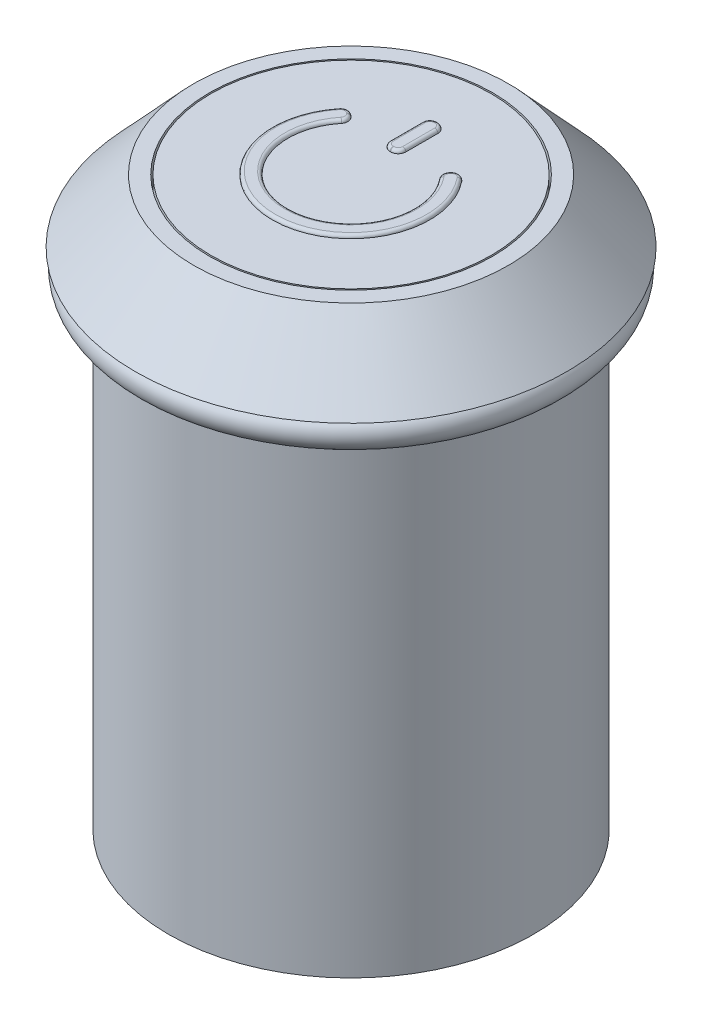
ISO-10303-21;
HEADER;
FILE_DESCRIPTION(('STEP AP214'),'2;1');
FILE_NAME('part.step','',(''),(''),'','','');
FILE_SCHEMA(('AUTOMOTIVE_DESIGN { 1 0 10303 214 1 1 1 1 }'));
ENDSEC;
DATA;
#1=APPLICATION_CONTEXT('core data for automotive mechanical design processes');
#2=APPLICATION_PROTOCOL_DEFINITION('international standard','automotive_design',2000,#1);
#3=PRODUCT_CONTEXT('',#1,'mechanical');
#4=PRODUCT('Part','Part','',(#3));
#5=PRODUCT_RELATED_PRODUCT_CATEGORY('part','',(#4));
#6=PRODUCT_DEFINITION_FORMATION('','',#4);
#7=PRODUCT_DEFINITION_CONTEXT('part definition',#1,'design');
#8=PRODUCT_DEFINITION('design','',#6,#7);
#9=PRODUCT_DEFINITION_SHAPE('','',#8);
#10=(LENGTH_UNIT() NAMED_UNIT(*) SI_UNIT(.MILLI.,.METRE.));
#11=(NAMED_UNIT(*) PLANE_ANGLE_UNIT() SI_UNIT($,.RADIAN.));
#12=(NAMED_UNIT(*) SI_UNIT($,.STERADIAN.) SOLID_ANGLE_UNIT());
#13=UNCERTAINTY_MEASURE_WITH_UNIT(LENGTH_MEASURE(1.E-05),#10,'distance_accuracy_value','');
#14=(GEOMETRIC_REPRESENTATION_CONTEXT(3) GLOBAL_UNCERTAINTY_ASSIGNED_CONTEXT((#13)) GLOBAL_UNIT_ASSIGNED_CONTEXT((#10,
#11,#12)) REPRESENTATION_CONTEXT('',''));
#15=CARTESIAN_POINT('',(0.,0.,0.));
#16=DIRECTION('',(0.,0.,1.));
#17=DIRECTION('',(1.,0.,0.));
#18=AXIS2_PLACEMENT_3D('',#15,#16,#17);
#19=CARTESIAN_POINT('',(0.,15.5,0.));
#20=DIRECTION('',(0.,-1.,0.));
#21=DIRECTION('',(0.,0.,-1.));
#22=AXIS2_PLACEMENT_3D('',#19,#20,#21);
#23=TOROIDAL_SURFACE('',#22,6.3,0.500000000000001);
#24=CARTESIAN_POINT('',(0.,15.5,-6.8));
#25=VERTEX_POINT('',#24);
#26=VERTEX_LOOP('',#25);
#27=FACE_BOUND('',#26,.T.);
#28=ADVANCED_FACE('F42',(#27),#23,.T.);
#29=CLOSED_SHELL('',(#28));
#30=MANIFOLD_SOLID_BREP('B2',#29);
#31=CARTESIAN_POINT('',(0.,18.,0.));
#32=DIRECTION('',(0.,1.,0.));
#33=DIRECTION('',(0.,0.,1.));
#34=AXIS2_PLACEMENT_3D('',#31,#32,#33);
#35=PLANE('',#34);
#36=CARTESIAN_POINT('',(0.,18.,0.));
#37=DIRECTION('',(0.,1.,0.));
#38=DIRECTION('',(0.,0.,1.));
#39=AXIS2_PLACEMENT_3D('',#36,#37,#38);
#40=CIRCLE('',#39,4.45);
#41=CARTESIAN_POINT('',(0.,18.,4.45));
#42=VERTEX_POINT('',#41);
#43=EDGE_CURVE('E316',#42,#42,#40,.T.);
#44=ORIENTED_EDGE('',*,*,#43,.T.);
#45=EDGE_LOOP('',(#44));
#46=FACE_BOUND('',#45,.T.);
#47=DIRECTION('',(1.,0.,0.));
#48=VECTOR('',#47,1.);
#49=CARTESIAN_POINT('',(-0.00999999999999816,18.,-1.25));
#50=LINE('',#49,#48);
#51=CARTESIAN_POINT('',(-0.00999999999999816,18.,-1.25));
#52=VERTEX_POINT('',#51);
#53=CARTESIAN_POINT('',(0.00999999999999848,18.,-1.25));
#54=VERTEX_POINT('',#53);
#55=EDGE_CURVE('E297',#52,#54,#50,.T.);
#56=ORIENTED_EDGE('',*,*,#55,.F.);
#57=CARTESIAN_POINT('',(-0.00999999999999992,18.,-1.49));
#58=DIRECTION('',(0.,1.,0.));
#59=DIRECTION('',(0.,0.,1.));
#60=AXIS2_PLACEMENT_3D('',#57,#58,#59);
#61=CIRCLE('',#60,0.24);
#62=CARTESIAN_POINT('',(-0.25,18.,-1.49));
#63=VERTEX_POINT('',#62);
#64=EDGE_CURVE('E295',#63,#52,#61,.T.);
#65=ORIENTED_EDGE('',*,*,#64,.F.);
#66=DIRECTION('',(0.,0.,1.));
#67=VECTOR('',#66,1.);
#68=CARTESIAN_POINT('',(-0.25,18.,-2.51));
#69=LINE('',#68,#67);
#70=CARTESIAN_POINT('',(-0.25,18.,-2.51));
#71=VERTEX_POINT('',#70);
#72=EDGE_CURVE('E313',#71,#63,#69,.T.);
#73=ORIENTED_EDGE('',*,*,#72,.F.);
#74=CARTESIAN_POINT('',(-0.0100000000000001,18.,-2.51));
#75=DIRECTION('',(0.,1.,0.));
#76=DIRECTION('',(0.,0.,1.));
#77=AXIS2_PLACEMENT_3D('',#74,#75,#76);
#78=CIRCLE('',#77,0.24);
#79=CARTESIAN_POINT('',(-0.00999999999999837,18.,-2.75));
#80=VERTEX_POINT('',#79);
#81=EDGE_CURVE('E279',#80,#71,#78,.T.);
#82=ORIENTED_EDGE('',*,*,#81,.F.);
#83=DIRECTION('',(-1.,0.,0.));
#84=VECTOR('',#83,1.);
#85=CARTESIAN_POINT('',(-0.00999999999999837,18.,-2.75));
#86=LINE('',#85,#84);
#87=CARTESIAN_POINT('',(0.00999999999999832,18.,-2.75));
#88=VERTEX_POINT('',#87);
#89=EDGE_CURVE('E274',#88,#80,#86,.T.);
#90=ORIENTED_EDGE('',*,*,#89,.F.);
#91=CARTESIAN_POINT('',(0.01,18.,-2.51));
#92=DIRECTION('',(0.,1.,0.));
#93=DIRECTION('',(0.,0.,-1.));
#94=AXIS2_PLACEMENT_3D('',#91,#92,#93);
#95=CIRCLE('',#94,0.24);
#96=CARTESIAN_POINT('',(0.25,18.,-2.51));
#97=VERTEX_POINT('',#96);
#98=EDGE_CURVE('E270',#97,#88,#95,.T.);
#99=ORIENTED_EDGE('',*,*,#98,.F.);
#100=DIRECTION('',(0.,0.,-1.));
#101=VECTOR('',#100,1.);
#102=CARTESIAN_POINT('',(0.25,18.,-2.51));
#103=LINE('',#102,#101);
#104=CARTESIAN_POINT('',(0.25,18.,-1.49));
#105=VERTEX_POINT('',#104);
#106=EDGE_CURVE('E307',#105,#97,#103,.T.);
#107=ORIENTED_EDGE('',*,*,#106,.F.);
#108=CARTESIAN_POINT('',(0.0100000000000002,18.,-1.49));
#109=DIRECTION('',(0.,1.,0.));
#110=DIRECTION('',(0.,0.,1.));
#111=AXIS2_PLACEMENT_3D('',#108,#109,#110);
#112=CIRCLE('',#111,0.24);
#113=EDGE_CURVE('E300',#54,#105,#112,.T.);
#114=ORIENTED_EDGE('',*,*,#113,.F.);
#115=EDGE_LOOP('',(#56,#65,#73,#82,#90,#99,#107,#114));
#116=FACE_BOUND('',#115,.T.);
#117=CARTESIAN_POINT('',(0.,18.,0.));
#118=DIRECTION('',(0.,-1.,0.));
#119=DIRECTION('',(0.,0.,1.));
#120=AXIS2_PLACEMENT_3D('',#117,#118,#119);
#121=CIRCLE('',#120,2.);
#122=CARTESIAN_POINT('',(1.55759571632779,18.,-1.25454995296214));
#123=VERTEX_POINT('',#122);
#124=CARTESIAN_POINT('',(-1.55759571632779,18.,-1.25454995296214));
#125=VERTEX_POINT('',#124);
#126=EDGE_CURVE('E166',#123,#125,#121,.T.);
#127=ORIENTED_EDGE('',*,*,#126,.F.);
#128=CARTESIAN_POINT('',(1.74450720228713,18.,-1.4050959473176));
#129=DIRECTION('',(0.,1.,0.));
#130=DIRECTION('',(0.,0.,-1.));
#131=AXIS2_PLACEMENT_3D('',#128,#129,#130);
#132=CIRCLE('',#131,0.24);
#133=CARTESIAN_POINT('',(1.57480157480236,18.,-1.57480157480237));
#134=VERTEX_POINT('',#133);
#135=EDGE_CURVE('E168',#134,#123,#132,.T.);
#136=ORIENTED_EDGE('',*,*,#135,.F.);
#137=DIRECTION('',(-0.707106781186553,0.,0.707106781186542));
#138=VECTOR('',#137,1.);
#139=CARTESIAN_POINT('',(1.57480157480236,18.,-1.57480157480237));
#140=LINE('',#139,#138);
#141=CARTESIAN_POINT('',(1.58902485820706,18.,-1.58902485820704));
#142=VERTEX_POINT('',#141);
#143=EDGE_CURVE('E298',#142,#134,#140,.T.);
#144=ORIENTED_EDGE('',*,*,#143,.F.);
#145=CARTESIAN_POINT('',(1.75873048569184,18.,-1.41931923072231));
#146=DIRECTION('',(0.,1.,0.));
#147=DIRECTION('',(0.,0.,-1.));
#148=AXIS2_PLACEMENT_3D('',#145,#146,#147);
#149=CIRCLE('',#148,0.240000000000001);
#150=CARTESIAN_POINT('',(1.94549832488035,18.,-1.57004339681671));
#151=VERTEX_POINT('',#150);
#152=EDGE_CURVE('E302',#151,#142,#149,.T.);
#153=ORIENTED_EDGE('',*,*,#152,.F.);
#154=CARTESIAN_POINT('',(0.,18.,0.));
#155=DIRECTION('',(0.,1.,0.));
#156=DIRECTION('',(0.,0.,1.));
#157=AXIS2_PLACEMENT_3D('',#154,#155,#156);
#158=CIRCLE('',#157,2.5);
#159=CARTESIAN_POINT('',(-1.94549832488035,18.,-1.57004339681671));
#160=VERTEX_POINT('',#159);
#161=EDGE_CURVE('E457',#160,#151,#158,.T.);
#162=ORIENTED_EDGE('',*,*,#161,.F.);
#163=CARTESIAN_POINT('',(-1.75873048569183,18.,-1.41931923072231));
#164=DIRECTION('',(0.,1.,0.));
#165=DIRECTION('',(0.,0.,1.));
#166=AXIS2_PLACEMENT_3D('',#163,#164,#165);
#167=CIRCLE('',#166,0.24);
#168=CARTESIAN_POINT('',(-1.58902485820706,18.,-1.58902485820708));
#169=VERTEX_POINT('',#168);
#170=EDGE_CURVE('E459',#169,#160,#167,.T.);
#171=ORIENTED_EDGE('',*,*,#170,.F.);
#172=DIRECTION('',(-0.707106781186548,0.,-0.707106781186548));
#173=VECTOR('',#172,1.);
#174=CARTESIAN_POINT('',(-1.58902485820706,18.,-1.58902485820708));
#175=LINE('',#174,#173);
#176=CARTESIAN_POINT('',(-1.57480157480235,18.,-1.57480157480237));
#177=VERTEX_POINT('',#176);
#178=EDGE_CURVE('E461',#177,#169,#175,.T.);
#179=ORIENTED_EDGE('',*,*,#178,.F.);
#180=CARTESIAN_POINT('',(-1.74450720228713,18.,-1.4050959473176));
#181=DIRECTION('',(0.,1.,0.));
#182=DIRECTION('',(0.,0.,1.));
#183=AXIS2_PLACEMENT_3D('',#180,#181,#182);
#184=CIRCLE('',#183,0.24);
#185=EDGE_CURVE('E171',#125,#177,#184,.T.);
#186=ORIENTED_EDGE('',*,*,#185,.F.);
#187=EDGE_LOOP('',(#127,#136,#144,#153,#162,#171,#179,#186));
#188=FACE_BOUND('',#187,.T.);
#189=ADVANCED_FACE('F54',(#46,#116,#188),#35,.T.);
#190=CARTESIAN_POINT('',(0.,16.,0.));
#191=DIRECTION('',(0.,-1.,0.));
#192=DIRECTION('',(0.,0.,-1.));
#193=AXIS2_PLACEMENT_3D('',#190,#191,#192);
#194=CYLINDRICAL_SURFACE('',#193,5.8);
#195=CARTESIAN_POINT('',(0.,0.,0.));
#196=DIRECTION('',(0.,1.,0.));
#197=DIRECTION('',(0.,0.,1.));
#198=AXIS2_PLACEMENT_3D('',#195,#196,#197);
#199=CIRCLE('',#198,5.8);
#200=CARTESIAN_POINT('',(0.,0.,5.8));
#201=VERTEX_POINT('',#200);
#202=EDGE_CURVE('E434',#201,#201,#199,.T.);
#203=ORIENTED_EDGE('',*,*,#202,.T.);
#204=EDGE_LOOP('',(#203));
#205=FACE_BOUND('',#204,.T.);
#206=CARTESIAN_POINT('',(0.,16.,0.));
#207=DIRECTION('',(0.,1.,0.));
#208=DIRECTION('',(0.,0.,1.));
#209=AXIS2_PLACEMENT_3D('',#206,#207,#208);
#210=CIRCLE('',#209,5.8);
#211=CARTESIAN_POINT('',(0.,16.,5.8));
#212=VERTEX_POINT('',#211);
#213=EDGE_CURVE('E441',#212,#212,#210,.T.);
#214=ORIENTED_EDGE('',*,*,#213,.F.);
#215=EDGE_LOOP('',(#214));
#216=FACE_BOUND('',#215,.T.);
#217=ADVANCED_FACE('F358',(#205,#216),#194,.T.);
#218=CARTESIAN_POINT('',(0.,0.,0.));
#219=DIRECTION('',(0.,1.,0.));
#220=DIRECTION('',(0.,0.,1.));
#221=AXIS2_PLACEMENT_3D('',#218,#219,#220);
#222=PLANE('',#221);
#223=ORIENTED_EDGE('',*,*,#202,.F.);
#224=EDGE_LOOP('',(#223));
#225=FACE_BOUND('',#224,.T.);
#226=ADVANCED_FACE('F354',(#225),#222,.F.);
#227=CARTESIAN_POINT('',(0.,16.,0.));
#228=DIRECTION('',(0.,1.,0.));
#229=DIRECTION('',(0.,0.,1.));
#230=AXIS2_PLACEMENT_3D('',#227,#228,#229);
#231=PLANE('',#230);
#232=CARTESIAN_POINT('',(0.,16.,0.));
#233=DIRECTION('',(0.,1.,0.));
#234=DIRECTION('',(0.,0.,1.));
#235=AXIS2_PLACEMENT_3D('',#232,#233,#234);
#236=CIRCLE('',#235,6.85);
#237=CARTESIAN_POINT('',(0.,16.,6.85));
#238=VERTEX_POINT('',#237);
#239=EDGE_CURVE('E431',#238,#238,#236,.T.);
#240=ORIENTED_EDGE('',*,*,#239,.F.);
#241=EDGE_LOOP('',(#240));
#242=FACE_BOUND('',#241,.T.);
#243=ORIENTED_EDGE('',*,*,#213,.T.);
#244=EDGE_LOOP('',(#243));
#245=FACE_BOUND('',#244,.T.);
#246=ADVANCED_FACE('F351',(#242,#245),#231,.F.);
#247=CARTESIAN_POINT('',(0.,18.,0.));
#248=DIRECTION('',(0.,1.,0.));
#249=DIRECTION('',(0.,0.,1.));
#250=AXIS2_PLACEMENT_3D('',#247,#248,#249);
#251=PLANE('',#250);
#252=CARTESIAN_POINT('',(0.,18.,0.));
#253=DIRECTION('',(0.,1.,0.));
#254=DIRECTION('',(0.,0.,1.));
#255=AXIS2_PLACEMENT_3D('',#252,#253,#254);
#256=CIRCLE('',#255,4.5);
#257=CARTESIAN_POINT('',(0.,18.,4.5));
#258=VERTEX_POINT('',#257);
#259=EDGE_CURVE('E319',#258,#258,#256,.T.);
#260=ORIENTED_EDGE('',*,*,#259,.F.);
#261=EDGE_LOOP('',(#260));
#262=FACE_BOUND('',#261,.T.);
#263=CARTESIAN_POINT('',(0.,18.,0.));
#264=DIRECTION('',(0.,1.,0.));
#265=DIRECTION('',(0.,0.,1.));
#266=AXIS2_PLACEMENT_3D('',#263,#264,#265);
#267=CIRCLE('',#266,5.);
#268=CARTESIAN_POINT('',(0.,18.,5.));
#269=VERTEX_POINT('',#268);
#270=EDGE_CURVE('E325',#269,#269,#267,.T.);
#271=ORIENTED_EDGE('',*,*,#270,.T.);
#272=EDGE_LOOP('',(#271));
#273=FACE_BOUND('',#272,.T.);
#274=ADVANCED_FACE('F348',(#262,#273),#251,.T.);
#275=CARTESIAN_POINT('',(0.,18.,0.));
#276=DIRECTION('',(0.,-1.,0.));
#277=DIRECTION('',(0.,0.,-1.));
#278=AXIS2_PLACEMENT_3D('',#275,#276,#277);
#279=CONICAL_SURFACE('',#278,5.,0.746456820300408);
#280=ORIENTED_EDGE('',*,*,#270,.F.);
#281=EDGE_LOOP('',(#280));
#282=FACE_BOUND('',#281,.T.);
#283=ORIENTED_EDGE('',*,*,#239,.T.);
#284=EDGE_LOOP('',(#283));
#285=FACE_BOUND('',#284,.T.);
#286=ADVANCED_FACE('F337',(#282,#285),#279,.T.);
#287=CARTESIAN_POINT('',(0.,15.,0.));
#288=DIRECTION('',(0.,1.,0.));
#289=DIRECTION('',(0.,0.,1.));
#290=AXIS2_PLACEMENT_3D('',#287,#288,#289);
#291=CYLINDRICAL_SURFACE('',#290,4.5);
#292=CARTESIAN_POINT('',(0.,15.,0.));
#293=DIRECTION('',(0.,1.,0.));
#294=DIRECTION('',(0.,0.,1.));
#295=AXIS2_PLACEMENT_3D('',#292,#293,#294);
#296=CIRCLE('',#295,4.5);
#297=CARTESIAN_POINT('',(0.,15.,4.5));
#298=VERTEX_POINT('',#297);
#299=EDGE_CURVE('E322',#298,#298,#296,.T.);
#300=ORIENTED_EDGE('',*,*,#299,.F.);
#301=EDGE_LOOP('',(#300));
#302=FACE_BOUND('',#301,.T.);
#303=ORIENTED_EDGE('',*,*,#259,.T.);
#304=EDGE_LOOP('',(#303));
#305=FACE_BOUND('',#304,.T.);
#306=ADVANCED_FACE('F347',(#302,#305),#291,.F.);
#307=CARTESIAN_POINT('',(0.,15.,0.));
#308=DIRECTION('',(0.,1.,0.));
#309=DIRECTION('',(0.,0.,1.));
#310=AXIS2_PLACEMENT_3D('',#307,#308,#309);
#311=PLANE('',#310);
#312=CARTESIAN_POINT('',(0.,15.,0.));
#313=DIRECTION('',(0.,1.,0.));
#314=DIRECTION('',(0.,0.,1.));
#315=AXIS2_PLACEMENT_3D('',#312,#313,#314);
#316=CIRCLE('',#315,4.45);
#317=CARTESIAN_POINT('',(0.,15.,4.45));
#318=VERTEX_POINT('',#317);
#319=EDGE_CURVE('E315',#318,#318,#316,.T.);
#320=ORIENTED_EDGE('',*,*,#319,.F.);
#321=EDGE_LOOP('',(#320));
#322=FACE_BOUND('',#321,.T.);
#323=ORIENTED_EDGE('',*,*,#299,.T.);
#324=EDGE_LOOP('',(#323));
#325=FACE_BOUND('',#324,.T.);
#326=ADVANCED_FACE('F417',(#322,#325),#311,.T.);
#327=CARTESIAN_POINT('',(0.,18.,0.));
#328=DIRECTION('',(0.,-1.,0.));
#329=DIRECTION('',(0.,0.,-1.));
#330=AXIS2_PLACEMENT_3D('',#327,#328,#329);
#331=CYLINDRICAL_SURFACE('',#330,4.45);
#332=ORIENTED_EDGE('',*,*,#43,.F.);
#333=EDGE_LOOP('',(#332));
#334=FACE_BOUND('',#333,.T.);
#335=ORIENTED_EDGE('',*,*,#319,.T.);
#336=EDGE_LOOP('',(#335));
#337=FACE_BOUND('',#336,.T.);
#338=ADVANCED_FACE('F414',(#334,#337),#331,.T.);
#339=CARTESIAN_POINT('',(-0.00999999999999992,18.1,-1.49));
#340=DIRECTION('',(0.,1.,0.));
#341=DIRECTION('',(0.,0.,1.));
#342=AXIS2_PLACEMENT_3D('',#339,#340,#341);
#343=PLANE('',#342);
#344=CARTESIAN_POINT('',(-0.0100000000000001,18.1,-2.51));
#345=DIRECTION('',(0.,1.,0.));
#346=DIRECTION('',(0.,0.,1.));
#347=AXIS2_PLACEMENT_3D('',#344,#345,#346);
#348=CIRCLE('',#347,0.14);
#349=CARTESIAN_POINT('',(-0.0099999999999991,18.1,-2.65));
#350=VERTEX_POINT('',#349);
#351=CARTESIAN_POINT('',(-0.15,18.1,-2.51));
#352=VERTEX_POINT('',#351);
#353=EDGE_CURVE('E63',#350,#352,#348,.T.);
#354=ORIENTED_EDGE('',*,*,#353,.T.);
#355=DIRECTION('',(0.,0.,1.));
#356=VECTOR('',#355,1.);
#357=CARTESIAN_POINT('',(-0.15,18.1,-1.49));
#358=LINE('',#357,#356);
#359=CARTESIAN_POINT('',(-0.15,18.1,-1.49));
#360=VERTEX_POINT('',#359);
#361=EDGE_CURVE('E40',#352,#360,#358,.T.);
#362=ORIENTED_EDGE('',*,*,#361,.T.);
#363=CARTESIAN_POINT('',(-0.00999999999999992,18.1,-1.49));
#364=DIRECTION('',(0.,1.,0.));
#365=DIRECTION('',(0.,0.,1.));
#366=AXIS2_PLACEMENT_3D('',#363,#364,#365);
#367=CIRCLE('',#366,0.14);
#368=CARTESIAN_POINT('',(-0.00999999999999816,18.1,-1.35));
#369=VERTEX_POINT('',#368);
#370=EDGE_CURVE('E256',#360,#369,#367,.T.);
#371=ORIENTED_EDGE('',*,*,#370,.T.);
#372=DIRECTION('',(1.,0.,0.));
#373=VECTOR('',#372,1.);
#374=CARTESIAN_POINT('',(0.00999999999999848,18.1,-1.35));
#375=LINE('',#374,#373);
#376=CARTESIAN_POINT('',(0.0099999999999992,18.1,-1.35));
#377=VERTEX_POINT('',#376);
#378=EDGE_CURVE('E258',#369,#377,#375,.T.);
#379=ORIENTED_EDGE('',*,*,#378,.T.);
#380=CARTESIAN_POINT('',(0.0100000000000002,18.1,-1.49));
#381=DIRECTION('',(0.,1.,0.));
#382=DIRECTION('',(0.,0.,1.));
#383=AXIS2_PLACEMENT_3D('',#380,#381,#382);
#384=CIRCLE('',#383,0.14);
#385=CARTESIAN_POINT('',(0.15,18.1,-1.49));
#386=VERTEX_POINT('',#385);
#387=EDGE_CURVE('E260',#377,#386,#384,.T.);
#388=ORIENTED_EDGE('',*,*,#387,.T.);
#389=DIRECTION('',(0.,0.,-1.));
#390=VECTOR('',#389,1.);
#391=CARTESIAN_POINT('',(0.15,18.1,-2.51));
#392=LINE('',#391,#390);
#393=CARTESIAN_POINT('',(0.15,18.1,-2.51));
#394=VERTEX_POINT('',#393);
#395=EDGE_CURVE('E262',#386,#394,#392,.T.);
#396=ORIENTED_EDGE('',*,*,#395,.T.);
#397=CARTESIAN_POINT('',(0.01,18.1,-2.51));
#398=DIRECTION('',(0.,1.,0.));
#399=DIRECTION('',(0.,0.,1.));
#400=AXIS2_PLACEMENT_3D('',#397,#398,#399);
#401=CIRCLE('',#400,0.14);
#402=CARTESIAN_POINT('',(0.00999999999999832,18.1,-2.65));
#403=VERTEX_POINT('',#402);
#404=EDGE_CURVE('E264',#394,#403,#401,.T.);
#405=ORIENTED_EDGE('',*,*,#404,.T.);
#406=DIRECTION('',(-1.,0.,0.));
#407=VECTOR('',#406,1.);
#408=CARTESIAN_POINT('',(-0.00999999999999837,18.1,-2.65));
#409=LINE('',#408,#407);
#410=EDGE_CURVE('E74',#403,#350,#409,.T.);
#411=ORIENTED_EDGE('',*,*,#410,.T.);
#412=EDGE_LOOP('',(#354,#362,#371,#379,#388,#396,#405,#411));
#413=FACE_BOUND('',#412,.T.);
#414=ADVANCED_FACE('F267',(#413),#343,.T.);
#415=CARTESIAN_POINT('',(1.74450720228713,18.1,-1.4050959473176));
#416=DIRECTION('',(0.,-1.,0.));
#417=DIRECTION('',(0.,0.,-1.));
#418=AXIS2_PLACEMENT_3D('',#415,#416,#417);
#419=PLANE('',#418);
#420=DIRECTION('',(-0.707106781186548,0.,-0.707106781186548));
#421=VECTOR('',#420,1.);
#422=CARTESIAN_POINT('',(0.0989949493661179,18.1,0.240416305603411));
#423=LINE('',#422,#421);
#424=CARTESIAN_POINT('',(-1.64551225292101,18.1,-1.50409089668372));
#425=VERTEX_POINT('',#424);
#426=CARTESIAN_POINT('',(-1.65973553632572,18.1,-1.51831418008842));
#427=VERTEX_POINT('',#426);
#428=EDGE_CURVE('E246',#425,#427,#423,.T.);
#429=ORIENTED_EDGE('',*,*,#428,.T.);
#430=CARTESIAN_POINT('',(-1.75873048569183,18.1,-1.41931923072231));
#431=DIRECTION('',(0.,-1.,0.));
#432=DIRECTION('',(0.,0.,-1.));
#433=AXIS2_PLACEMENT_3D('',#430,#431,#432);
#434=CIRCLE('',#433,0.14);
#435=CARTESIAN_POINT('',(-1.86767839188513,18.1,-1.50724166094404));
#436=VERTEX_POINT('',#435);
#437=EDGE_CURVE('E248',#427,#436,#434,.F.);
#438=ORIENTED_EDGE('',*,*,#437,.T.);
#439=CARTESIAN_POINT('',(0.,18.1,0.));
#440=DIRECTION('',(0.,-1.,0.));
#441=DIRECTION('',(0.,0.,-1.));
#442=AXIS2_PLACEMENT_3D('',#439,#440,#441);
#443=CIRCLE('',#442,2.4);
#444=CARTESIAN_POINT('',(1.86767839188514,18.1,-1.50724166094404));
#445=VERTEX_POINT('',#444);
#446=EDGE_CURVE('E444',#436,#445,#443,.F.);
#447=ORIENTED_EDGE('',*,*,#446,.T.);
#448=CARTESIAN_POINT('',(1.75873048569184,18.1,-1.41931923072231));
#449=DIRECTION('',(0.,-1.,0.));
#450=DIRECTION('',(0.,0.,-1.));
#451=AXIS2_PLACEMENT_3D('',#448,#449,#450);
#452=CIRCLE('',#451,0.140000000000001);
#453=CARTESIAN_POINT('',(1.6597355363257,18.1,-1.5183141800884));
#454=VERTEX_POINT('',#453);
#455=EDGE_CURVE('E448',#445,#454,#452,.F.);
#456=ORIENTED_EDGE('',*,*,#455,.T.);
#457=DIRECTION('',(-0.707106781186553,0.,0.707106781186542));
#458=VECTOR('',#457,1.);
#459=CARTESIAN_POINT('',(1.64551225292101,18.1,-1.50409089668372));
#460=LINE('',#459,#458);
#461=CARTESIAN_POINT('',(1.64551225292101,18.1,-1.50409089668372));
#462=VERTEX_POINT('',#461);
#463=EDGE_CURVE('E450',#454,#462,#460,.T.);
#464=ORIENTED_EDGE('',*,*,#463,.T.);
#465=CARTESIAN_POINT('',(1.74450720228713,18.1,-1.4050959473176));
#466=DIRECTION('',(0.,-1.,0.));
#467=DIRECTION('',(0.,0.,-1.));
#468=AXIS2_PLACEMENT_3D('',#465,#466,#467);
#469=CIRCLE('',#468,0.14);
#470=CARTESIAN_POINT('',(1.63547550214418,18.1,-1.31727745061025));
#471=VERTEX_POINT('',#470);
#472=EDGE_CURVE('E250',#462,#471,#469,.F.);
#473=ORIENTED_EDGE('',*,*,#472,.T.);
#474=CARTESIAN_POINT('',(0.,18.1,0.));
#475=DIRECTION('',(0.,-1.,0.));
#476=DIRECTION('',(0.,0.,-1.));
#477=AXIS2_PLACEMENT_3D('',#474,#475,#476);
#478=CIRCLE('',#477,2.1);
#479=CARTESIAN_POINT('',(-1.63547550214418,18.1,-1.31727745061025));
#480=VERTEX_POINT('',#479);
#481=EDGE_CURVE('E188',#471,#480,#478,.T.);
#482=ORIENTED_EDGE('',*,*,#481,.T.);
#483=CARTESIAN_POINT('',(-1.74450720228713,18.1,-1.4050959473176));
#484=DIRECTION('',(0.,-1.,0.));
#485=DIRECTION('',(0.,0.,-1.));
#486=AXIS2_PLACEMENT_3D('',#483,#484,#485);
#487=CIRCLE('',#486,0.14);
#488=EDGE_CURVE('E243',#480,#425,#487,.F.);
#489=ORIENTED_EDGE('',*,*,#488,.T.);
#490=EDGE_LOOP('',(#429,#438,#447,#456,#464,#473,#482,#489));
#491=FACE_BOUND('',#490,.T.);
#492=ADVANCED_FACE('F388',(#491),#419,.F.);
#493=CARTESIAN_POINT('',(1.74450720228713,18.,-1.4050959473176));
#494=DIRECTION('',(0.,-1.,0.));
#495=DIRECTION('',(0.,0.,-1.));
#496=AXIS2_PLACEMENT_3D('',#493,#494,#495);
#497=TOROIDAL_SURFACE('',#496,0.14,0.1);
#498=CARTESIAN_POINT('',(1.64551225292101,18.,-1.50409089668372));
#499=DIRECTION('',(0.707106781186549,0.,-0.707106781186546));
#500=DIRECTION('',(-0.707106781186546,0.,-0.707106781186549));
#501=AXIS2_PLACEMENT_3D('',#498,#499,#500);
#502=CIRCLE('',#501,0.1);
#503=EDGE_CURVE('E184',#134,#462,#502,.T.);
#504=ORIENTED_EDGE('',*,*,#503,.F.);
#505=ORIENTED_EDGE('',*,*,#135,.T.);
#506=CARTESIAN_POINT('',(1.63547550214418,18.,-1.31727745061025));
#507=DIRECTION('',(0.627274976481071,0.,0.778797858163896));
#508=DIRECTION('',(0.778797858163896,0.,-0.627274976481071));
#509=AXIS2_PLACEMENT_3D('',#506,#507,#508);
#510=CIRCLE('',#509,0.1);
#511=EDGE_CURVE('E181',#471,#123,#510,.T.);
#512=ORIENTED_EDGE('',*,*,#511,.F.);
#513=ORIENTED_EDGE('',*,*,#472,.F.);
#514=EDGE_LOOP('',(#504,#505,#512,#513));
#515=FACE_BOUND('',#514,.T.);
#516=ADVANCED_FACE('F179',(#515),#497,.T.);
#517=CARTESIAN_POINT('',(0.,18.,0.));
#518=DIRECTION('',(0.,-1.,0.));
#519=DIRECTION('',(0.,0.,-1.));
#520=AXIS2_PLACEMENT_3D('',#517,#518,#519);
#521=TOROIDAL_SURFACE('',#520,2.1,0.1);
#522=ORIENTED_EDGE('',*,*,#511,.T.);
#523=ORIENTED_EDGE('',*,*,#126,.T.);
#524=CARTESIAN_POINT('',(-1.63547550214418,18.,-1.31727745061025));
#525=DIRECTION('',(0.627274976481071,0.,-0.778797858163896));
#526=DIRECTION('',(-0.778797858163896,0.,-0.627274976481071));
#527=AXIS2_PLACEMENT_3D('',#524,#525,#526);
#528=CIRCLE('',#527,0.1);
#529=EDGE_CURVE('E190',#480,#125,#528,.T.);
#530=ORIENTED_EDGE('',*,*,#529,.F.);
#531=ORIENTED_EDGE('',*,*,#481,.F.);
#532=EDGE_LOOP('',(#522,#523,#530,#531));
#533=FACE_BOUND('',#532,.T.);
#534=ADVANCED_FACE('F187',(#533),#521,.T.);
#535=CARTESIAN_POINT('',(1.64551225292101,18.,-1.50409089668372));
#536=DIRECTION('',(-0.707106781186553,0.,0.707106781186542));
#537=DIRECTION('',(0.707106781186542,0.,0.707106781186553));
#538=AXIS2_PLACEMENT_3D('',#535,#536,#537);
#539=CYLINDRICAL_SURFACE('',#538,0.1);
#540=ORIENTED_EDGE('',*,*,#503,.T.);
#541=ORIENTED_EDGE('',*,*,#463,.F.);
#542=CARTESIAN_POINT('',(1.6597355363257,18.,-1.5183141800884));
#543=DIRECTION('',(0.707106781186553,0.,-0.707106781186542));
#544=DIRECTION('',(-0.707106781186542,0.,-0.707106781186553));
#545=AXIS2_PLACEMENT_3D('',#542,#543,#544);
#546=CIRCLE('',#545,0.1);
#547=EDGE_CURVE('E237',#142,#454,#546,.T.);
#548=ORIENTED_EDGE('',*,*,#547,.F.);
#549=ORIENTED_EDGE('',*,*,#143,.T.);
#550=EDGE_LOOP('',(#540,#541,#548,#549));
#551=FACE_BOUND('',#550,.T.);
#552=ADVANCED_FACE('F380',(#551),#539,.T.);
#553=CARTESIAN_POINT('',(-1.74450720228713,18.,-1.4050959473176));
#554=DIRECTION('',(0.,-1.,0.));
#555=DIRECTION('',(0.,0.,-1.));
#556=AXIS2_PLACEMENT_3D('',#553,#554,#555);
#557=TOROIDAL_SURFACE('',#556,0.14,0.1);
#558=ORIENTED_EDGE('',*,*,#529,.T.);
#559=ORIENTED_EDGE('',*,*,#185,.T.);
#560=CARTESIAN_POINT('',(-1.64551225292101,18.,-1.50409089668372));
#561=DIRECTION('',(-0.707106781186548,0.,-0.707106781186548));
#562=DIRECTION('',(-0.707106781186548,0.,0.707106781186548));
#563=AXIS2_PLACEMENT_3D('',#560,#561,#562);
#564=CIRCLE('',#563,0.1);
#565=EDGE_CURVE('E234',#425,#177,#564,.T.);
#566=ORIENTED_EDGE('',*,*,#565,.F.);
#567=ORIENTED_EDGE('',*,*,#488,.F.);
#568=EDGE_LOOP('',(#558,#559,#566,#567));
#569=FACE_BOUND('',#568,.T.);
#570=ADVANCED_FACE('F241',(#569),#557,.T.);
#571=CARTESIAN_POINT('',(1.75873048569184,18.,-1.41931923072231));
#572=DIRECTION('',(0.,-1.,0.));
#573=DIRECTION('',(0.,0.,-1.));
#574=AXIS2_PLACEMENT_3D('',#571,#572,#573);
#575=TOROIDAL_SURFACE('',#574,0.140000000000001,0.1);
#576=ORIENTED_EDGE('',*,*,#547,.T.);
#577=ORIENTED_EDGE('',*,*,#455,.F.);
#578=CARTESIAN_POINT('',(1.86767839188514,18.,-1.50724166094404));
#579=DIRECTION('',(0.628017358726683,0.,0.778199329952141));
#580=DIRECTION('',(0.778199329952141,0.,-0.628017358726683));
#581=AXIS2_PLACEMENT_3D('',#578,#579,#580);
#582=CIRCLE('',#581,0.1);
#583=EDGE_CURVE('E228',#151,#445,#582,.T.);
#584=ORIENTED_EDGE('',*,*,#583,.F.);
#585=ORIENTED_EDGE('',*,*,#152,.T.);
#586=EDGE_LOOP('',(#576,#577,#584,#585));
#587=FACE_BOUND('',#586,.T.);
#588=ADVANCED_FACE('F373',(#587),#575,.T.);
#589=CARTESIAN_POINT('',(0.0989949493661179,18.,0.240416305603411));
#590=DIRECTION('',(-0.707106781186548,0.,-0.707106781186548));
#591=DIRECTION('',(-0.707106781186548,0.,0.707106781186548));
#592=AXIS2_PLACEMENT_3D('',#589,#590,#591);
#593=CYLINDRICAL_SURFACE('',#592,0.1);
#594=ORIENTED_EDGE('',*,*,#565,.T.);
#595=ORIENTED_EDGE('',*,*,#178,.T.);
#596=CARTESIAN_POINT('',(-1.65973553632572,18.,-1.51831418008842));
#597=DIRECTION('',(-0.707106781186544,0.,-0.707106781186551));
#598=DIRECTION('',(-0.707106781186551,0.,0.707106781186544));
#599=AXIS2_PLACEMENT_3D('',#596,#597,#598);
#600=CIRCLE('',#599,0.1);
#601=EDGE_CURVE('E221',#427,#169,#600,.T.);
#602=ORIENTED_EDGE('',*,*,#601,.F.);
#603=ORIENTED_EDGE('',*,*,#428,.F.);
#604=EDGE_LOOP('',(#594,#595,#602,#603));
#605=FACE_BOUND('',#604,.T.);
#606=ADVANCED_FACE('F369',(#605),#593,.T.);
#607=CARTESIAN_POINT('',(0.,18.,0.));
#608=DIRECTION('',(0.,-1.,0.));
#609=DIRECTION('',(0.,0.,-1.));
#610=AXIS2_PLACEMENT_3D('',#607,#608,#609);
#611=TOROIDAL_SURFACE('',#610,2.4,0.1);
#612=ORIENTED_EDGE('',*,*,#583,.T.);
#613=ORIENTED_EDGE('',*,*,#446,.F.);
#614=CARTESIAN_POINT('',(-1.86767839188513,18.,-1.50724166094404));
#615=DIRECTION('',(0.628017358726685,0.,-0.778199329952139));
#616=DIRECTION('',(-0.778199329952139,0.,-0.628017358726685));
#617=AXIS2_PLACEMENT_3D('',#614,#615,#616);
#618=CIRCLE('',#617,0.1);
#619=EDGE_CURVE('E216',#160,#436,#618,.T.);
#620=ORIENTED_EDGE('',*,*,#619,.F.);
#621=ORIENTED_EDGE('',*,*,#161,.T.);
#622=EDGE_LOOP('',(#612,#613,#620,#621));
#623=FACE_BOUND('',#622,.T.);
#624=ADVANCED_FACE('F366',(#623),#611,.T.);
#625=CARTESIAN_POINT('',(-1.75873048569183,18.,-1.41931923072231));
#626=DIRECTION('',(0.,-1.,0.));
#627=DIRECTION('',(0.,0.,-1.));
#628=AXIS2_PLACEMENT_3D('',#625,#626,#627);
#629=TOROIDAL_SURFACE('',#628,0.14,0.1);
#630=ORIENTED_EDGE('',*,*,#601,.T.);
#631=ORIENTED_EDGE('',*,*,#170,.T.);
#632=ORIENTED_EDGE('',*,*,#619,.T.);
#633=ORIENTED_EDGE('',*,*,#437,.F.);
#634=EDGE_LOOP('',(#630,#631,#632,#633));
#635=FACE_BOUND('',#634,.T.);
#636=ADVANCED_FACE('F363',(#635),#629,.T.);
#637=CARTESIAN_POINT('',(0.15,18.,-1.49));
#638=DIRECTION('',(0.,0.,1.));
#639=DIRECTION('',(1.,0.,0.));
#640=AXIS2_PLACEMENT_3D('',#637,#638,#639);
#641=CYLINDRICAL_SURFACE('',#640,0.1);
#642=CARTESIAN_POINT('',(0.15,18.,-1.49));
#643=DIRECTION('',(0.,0.,1.));
#644=DIRECTION('',(1.,0.,0.));
#645=AXIS2_PLACEMENT_3D('',#642,#643,#644);
#646=CIRCLE('',#645,0.1);
#647=EDGE_CURVE('E209',#105,#386,#646,.T.);
#648=ORIENTED_EDGE('',*,*,#647,.F.);
#649=ORIENTED_EDGE('',*,*,#106,.T.);
#650=CARTESIAN_POINT('',(0.15,18.,-2.51));
#651=DIRECTION('',(0.,0.,-1.));
#652=DIRECTION('',(-1.,0.,0.));
#653=AXIS2_PLACEMENT_3D('',#650,#651,#652);
#654=CIRCLE('',#653,0.1);
#655=EDGE_CURVE('E58',#394,#97,#654,.T.);
#656=ORIENTED_EDGE('',*,*,#655,.F.);
#657=ORIENTED_EDGE('',*,*,#395,.F.);
#658=EDGE_LOOP('',(#648,#649,#656,#657));
#659=FACE_BOUND('',#658,.T.);
#660=ADVANCED_FACE('F56',(#659),#641,.T.);
#661=CARTESIAN_POINT('',(0.01,18.,-2.51));
#662=DIRECTION('',(0.,1.,0.));
#663=DIRECTION('',(0.,0.,1.));
#664=AXIS2_PLACEMENT_3D('',#661,#662,#663);
#665=TOROIDAL_SURFACE('',#664,0.14,0.1);
#666=ORIENTED_EDGE('',*,*,#655,.T.);
#667=ORIENTED_EDGE('',*,*,#98,.T.);
#668=CARTESIAN_POINT('',(0.00999999999999832,18.,-2.65));
#669=DIRECTION('',(-1.,0.,0.));
#670=DIRECTION('',(0.,0.,1.));
#671=AXIS2_PLACEMENT_3D('',#668,#669,#670);
#672=CIRCLE('',#671,0.1);
#673=EDGE_CURVE('E207',#403,#88,#672,.T.);
#674=ORIENTED_EDGE('',*,*,#673,.F.);
#675=ORIENTED_EDGE('',*,*,#404,.F.);
#676=EDGE_LOOP('',(#666,#667,#674,#675));
#677=FACE_BOUND('',#676,.T.);
#678=ADVANCED_FACE('F269',(#677),#665,.T.);
#679=CARTESIAN_POINT('',(0.0100000000000002,18.,-1.49));
#680=DIRECTION('',(0.,1.,0.));
#681=DIRECTION('',(0.,0.,1.));
#682=AXIS2_PLACEMENT_3D('',#679,#680,#681);
#683=TOROIDAL_SURFACE('',#682,0.14,0.1);
#684=ORIENTED_EDGE('',*,*,#647,.T.);
#685=ORIENTED_EDGE('',*,*,#387,.F.);
#686=CARTESIAN_POINT('',(0.0099999999999992,18.,-1.35));
#687=DIRECTION('',(-1.,0.,0.));
#688=DIRECTION('',(0.,0.,1.));
#689=AXIS2_PLACEMENT_3D('',#686,#687,#688);
#690=CIRCLE('',#689,0.1);
#691=EDGE_CURVE('E204',#54,#377,#690,.T.);
#692=ORIENTED_EDGE('',*,*,#691,.F.);
#693=ORIENTED_EDGE('',*,*,#113,.T.);
#694=EDGE_LOOP('',(#684,#685,#692,#693));
#695=FACE_BOUND('',#694,.T.);
#696=ADVANCED_FACE('F399',(#695),#683,.T.);
#697=CARTESIAN_POINT('',(-0.00999999999999992,18.,-2.65));
#698=DIRECTION('',(1.,0.,0.));
#699=DIRECTION('',(0.,0.,-1.));
#700=AXIS2_PLACEMENT_3D('',#697,#698,#699);
#701=CYLINDRICAL_SURFACE('',#700,0.1);
#702=ORIENTED_EDGE('',*,*,#673,.T.);
#703=ORIENTED_EDGE('',*,*,#89,.T.);
#704=CARTESIAN_POINT('',(-0.0099999999999991,18.,-2.65));
#705=DIRECTION('',(-1.,0.,0.));
#706=DIRECTION('',(0.,0.,1.));
#707=AXIS2_PLACEMENT_3D('',#704,#705,#706);
#708=CIRCLE('',#707,0.1);
#709=EDGE_CURVE('E201',#350,#80,#708,.T.);
#710=ORIENTED_EDGE('',*,*,#709,.F.);
#711=ORIENTED_EDGE('',*,*,#410,.F.);
#712=EDGE_LOOP('',(#702,#703,#710,#711));
#713=FACE_BOUND('',#712,.T.);
#714=ADVANCED_FACE('F273',(#713),#701,.T.);
#715=CARTESIAN_POINT('',(-0.00999999999999992,18.,-1.35));
#716=DIRECTION('',(-1.,0.,0.));
#717=DIRECTION('',(0.,0.,1.));
#718=AXIS2_PLACEMENT_3D('',#715,#716,#717);
#719=CYLINDRICAL_SURFACE('',#718,0.1);
#720=ORIENTED_EDGE('',*,*,#691,.T.);
#721=ORIENTED_EDGE('',*,*,#378,.F.);
#722=CARTESIAN_POINT('',(-0.00999999999999816,18.,-1.35));
#723=DIRECTION('',(-1.,0.,0.));
#724=DIRECTION('',(0.,0.,1.));
#725=AXIS2_PLACEMENT_3D('',#722,#723,#724);
#726=CIRCLE('',#725,0.1);
#727=EDGE_CURVE('E198',#52,#369,#726,.T.);
#728=ORIENTED_EDGE('',*,*,#727,.F.);
#729=ORIENTED_EDGE('',*,*,#55,.T.);
#730=EDGE_LOOP('',(#720,#721,#728,#729));
#731=FACE_BOUND('',#730,.T.);
#732=ADVANCED_FACE('F290',(#731),#719,.T.);
#733=CARTESIAN_POINT('',(-0.0100000000000001,18.,-2.51));
#734=DIRECTION('',(0.,1.,0.));
#735=DIRECTION('',(0.,0.,1.));
#736=AXIS2_PLACEMENT_3D('',#733,#734,#735);
#737=TOROIDAL_SURFACE('',#736,0.14,0.1);
#738=ORIENTED_EDGE('',*,*,#709,.T.);
#739=ORIENTED_EDGE('',*,*,#81,.T.);
#740=CARTESIAN_POINT('',(-0.15,18.,-2.51));
#741=DIRECTION('',(0.,0.,1.));
#742=DIRECTION('',(1.,0.,0.));
#743=AXIS2_PLACEMENT_3D('',#740,#741,#742);
#744=CIRCLE('',#743,0.1);
#745=EDGE_CURVE('E196',#352,#71,#744,.T.);
#746=ORIENTED_EDGE('',*,*,#745,.F.);
#747=ORIENTED_EDGE('',*,*,#353,.F.);
#748=EDGE_LOOP('',(#738,#739,#746,#747));
#749=FACE_BOUND('',#748,.T.);
#750=ADVANCED_FACE('F277',(#749),#737,.T.);
#751=CARTESIAN_POINT('',(-0.00999999999999992,18.,-1.49));
#752=DIRECTION('',(0.,1.,0.));
#753=DIRECTION('',(0.,0.,1.));
#754=AXIS2_PLACEMENT_3D('',#751,#752,#753);
#755=TOROIDAL_SURFACE('',#754,0.14,0.1);
#756=ORIENTED_EDGE('',*,*,#727,.T.);
#757=ORIENTED_EDGE('',*,*,#370,.F.);
#758=CARTESIAN_POINT('',(-0.15,18.,-1.49));
#759=DIRECTION('',(0.,0.,-1.));
#760=DIRECTION('',(0.,1.,0.));
#761=AXIS2_PLACEMENT_3D('',#758,#759,#760);
#762=CIRCLE('',#761,0.1);
#763=EDGE_CURVE('E194',#63,#360,#762,.T.);
#764=ORIENTED_EDGE('',*,*,#763,.F.);
#765=ORIENTED_EDGE('',*,*,#64,.T.);
#766=EDGE_LOOP('',(#756,#757,#764,#765));
#767=FACE_BOUND('',#766,.T.);
#768=ADVANCED_FACE('F294',(#767),#755,.T.);
#769=CARTESIAN_POINT('',(-0.15,18.,-1.49));
#770=DIRECTION('',(0.,0.,-1.));
#771=DIRECTION('',(-1.,0.,0.));
#772=AXIS2_PLACEMENT_3D('',#769,#770,#771);
#773=CYLINDRICAL_SURFACE('',#772,0.1);
#774=ORIENTED_EDGE('',*,*,#745,.T.);
#775=ORIENTED_EDGE('',*,*,#72,.T.);
#776=ORIENTED_EDGE('',*,*,#763,.T.);
#777=ORIENTED_EDGE('',*,*,#361,.F.);
#778=EDGE_LOOP('',(#774,#775,#776,#777));
#779=FACE_BOUND('',#778,.T.);
#780=ADVANCED_FACE('F283',(#779),#773,.T.);
#781=CLOSED_SHELL('',(#189,#217,#226,#246,#274,#286,#306,#326,#338,#414,#492,#516,#534,#552,
#570,#588,#606,#624,#636,#660,#678,#696,#714,#732,#750,#768,#780));
#782=MANIFOLD_SOLID_BREP('B7',#781);
#783=ADVANCED_BREP_SHAPE_REPRESENTATION('',(#18,#30,#782),#14);
#784=SHAPE_DEFINITION_REPRESENTATION(#9,#783);
ENDSEC;
END-ISO-10303-21;
